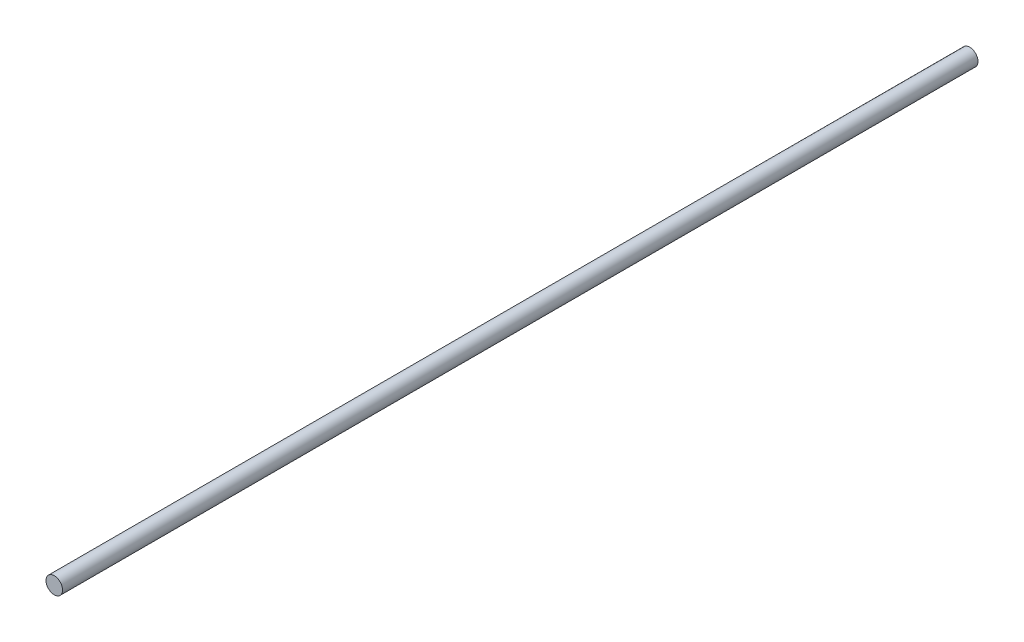
ISO-10303-21;
HEADER;
FILE_DESCRIPTION(('STEP AP214'),'2;1');
FILE_NAME('part.step','',(''),(''),'','','');
FILE_SCHEMA(('AUTOMOTIVE_DESIGN { 1 0 10303 214 1 1 1 1 }'));
ENDSEC;
DATA;
#1=APPLICATION_CONTEXT('core data for automotive mechanical design processes');
#2=APPLICATION_PROTOCOL_DEFINITION('international standard','automotive_design',2000,#1);
#3=PRODUCT_CONTEXT('',#1,'mechanical');
#4=PRODUCT('Part','Part','',(#3));
#5=PRODUCT_RELATED_PRODUCT_CATEGORY('part','',(#4));
#6=PRODUCT_DEFINITION_FORMATION('','',#4);
#7=PRODUCT_DEFINITION_CONTEXT('part definition',#1,'design');
#8=PRODUCT_DEFINITION('design','',#6,#7);
#9=PRODUCT_DEFINITION_SHAPE('','',#8);
#10=(LENGTH_UNIT() NAMED_UNIT(*) SI_UNIT(.MILLI.,.METRE.));
#11=(NAMED_UNIT(*) PLANE_ANGLE_UNIT() SI_UNIT($,.RADIAN.));
#12=(NAMED_UNIT(*) SI_UNIT($,.STERADIAN.) SOLID_ANGLE_UNIT());
#13=UNCERTAINTY_MEASURE_WITH_UNIT(LENGTH_MEASURE(1.E-05),#10,'distance_accuracy_value','');
#14=(GEOMETRIC_REPRESENTATION_CONTEXT(3) GLOBAL_UNCERTAINTY_ASSIGNED_CONTEXT((#13)) GLOBAL_UNIT_ASSIGNED_CONTEXT((#10,
#11,#12)) REPRESENTATION_CONTEXT('',''));
#15=CARTESIAN_POINT('',(0.,0.,0.));
#16=DIRECTION('',(0.,0.,1.));
#17=DIRECTION('',(1.,0.,0.));
#18=AXIS2_PLACEMENT_3D('',#15,#16,#17);
#19=CARTESIAN_POINT('',(0.,0.,2806.7));
#20=DIRECTION('',(0.,0.,-1.));
#21=DIRECTION('',(-1.,0.,0.));
#22=AXIS2_PLACEMENT_3D('',#19,#20,#21);
#23=CYLINDRICAL_SURFACE('',#22,50.8);
#24=CARTESIAN_POINT('',(0.,0.,2806.7));
#25=DIRECTION('',(0.,0.,1.));
#26=DIRECTION('',(1.,0.,0.));
#27=AXIS2_PLACEMENT_3D('',#24,#25,#26);
#28=CIRCLE('',#27,50.8);
#29=CARTESIAN_POINT('',(50.8,0.,2806.7));
#30=VERTEX_POINT('',#29);
#31=EDGE_CURVE('E10',#30,#30,#28,.T.);
#32=ORIENTED_EDGE('',*,*,#31,.F.);
#33=EDGE_LOOP('',(#32));
#34=FACE_BOUND('',#33,.T.);
#35=CARTESIAN_POINT('',(0.,0.,-2806.7));
#36=DIRECTION('',(0.,0.,1.));
#37=DIRECTION('',(1.,0.,0.));
#38=AXIS2_PLACEMENT_3D('',#35,#36,#37);
#39=CIRCLE('',#38,50.8);
#40=CARTESIAN_POINT('',(50.8,0.,-2806.7));
#41=VERTEX_POINT('',#40);
#42=EDGE_CURVE('E38',#41,#41,#39,.T.);
#43=ORIENTED_EDGE('',*,*,#42,.T.);
#44=EDGE_LOOP('',(#43));
#45=FACE_BOUND('',#44,.T.);
#46=ADVANCED_FACE('F35',(#34,#45),#23,.T.);
#47=CARTESIAN_POINT('',(0.,0.,2806.7));
#48=DIRECTION('',(0.,0.,1.));
#49=DIRECTION('',(1.,0.,0.));
#50=AXIS2_PLACEMENT_3D('',#47,#48,#49);
#51=PLANE('',#50);
#52=ORIENTED_EDGE('',*,*,#31,.T.);
#53=EDGE_LOOP('',(#52));
#54=FACE_BOUND('',#53,.T.);
#55=ADVANCED_FACE('F50',(#54),#51,.T.);
#56=CARTESIAN_POINT('',(0.,0.,-2806.7));
#57=DIRECTION('',(0.,0.,1.));
#58=DIRECTION('',(1.,0.,0.));
#59=AXIS2_PLACEMENT_3D('',#56,#57,#58);
#60=PLANE('',#59);
#61=ORIENTED_EDGE('',*,*,#42,.F.);
#62=EDGE_LOOP('',(#61));
#63=FACE_BOUND('',#62,.T.);
#64=ADVANCED_FACE('F48',(#63),#60,.F.);
#65=CLOSED_SHELL('',(#46,#55,#64));
#66=MANIFOLD_SOLID_BREP('B2',#65);
#67=ADVANCED_BREP_SHAPE_REPRESENTATION('',(#18,#66),#14);
#68=SHAPE_DEFINITION_REPRESENTATION(#9,#67);
ENDSEC;
END-ISO-10303-21;
